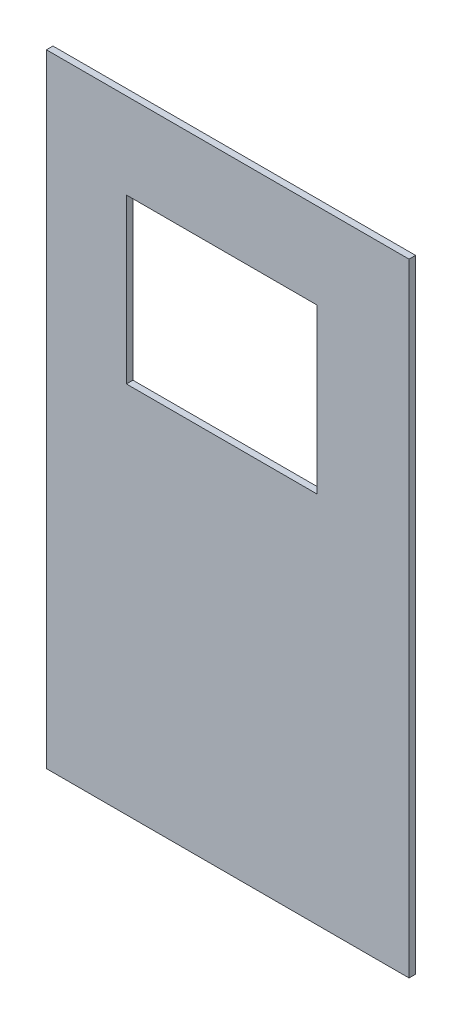
ISO-10303-21;
HEADER;
FILE_DESCRIPTION(('STEP AP214'),'2;1');
FILE_NAME('part.step','',(''),(''),'','','');
FILE_SCHEMA(('AUTOMOTIVE_DESIGN { 1 0 10303 214 1 1 1 1 }'));
ENDSEC;
DATA;
#1=APPLICATION_CONTEXT('core data for automotive mechanical design processes');
#2=APPLICATION_PROTOCOL_DEFINITION('international standard','automotive_design',2000,#1);
#3=PRODUCT_CONTEXT('',#1,'mechanical');
#4=PRODUCT('Part','Part','',(#3));
#5=PRODUCT_RELATED_PRODUCT_CATEGORY('part','',(#4));
#6=PRODUCT_DEFINITION_FORMATION('','',#4);
#7=PRODUCT_DEFINITION_CONTEXT('part definition',#1,'design');
#8=PRODUCT_DEFINITION('design','',#6,#7);
#9=PRODUCT_DEFINITION_SHAPE('','',#8);
#10=(LENGTH_UNIT() NAMED_UNIT(*) SI_UNIT(.MILLI.,.METRE.));
#11=(NAMED_UNIT(*) PLANE_ANGLE_UNIT() SI_UNIT($,.RADIAN.));
#12=(NAMED_UNIT(*) SI_UNIT($,.STERADIAN.) SOLID_ANGLE_UNIT());
#13=UNCERTAINTY_MEASURE_WITH_UNIT(LENGTH_MEASURE(1.E-05),#10,'distance_accuracy_value','');
#14=(GEOMETRIC_REPRESENTATION_CONTEXT(3) GLOBAL_UNCERTAINTY_ASSIGNED_CONTEXT((#13)) GLOBAL_UNIT_ASSIGNED_CONTEXT((#10,
#11,#12)) REPRESENTATION_CONTEXT('',''));
#15=CARTESIAN_POINT('',(0.,0.,0.));
#16=DIRECTION('',(0.,0.,1.));
#17=DIRECTION('',(1.,0.,0.));
#18=AXIS2_PLACEMENT_3D('',#15,#16,#17);
#19=CARTESIAN_POINT('',(-161.832061068702,173.5368956743,4.2));
#20=DIRECTION('',(1.,0.,0.));
#21=DIRECTION('',(0.,0.,-1.));
#22=AXIS2_PLACEMENT_3D('',#19,#20,#21);
#23=PLANE('',#22);
#24=DIRECTION('',(0.,-1.,0.));
#25=VECTOR('',#24,1.);
#26=CARTESIAN_POINT('',(-161.832061068702,173.5368956743,0.));
#27=LINE('',#26,#25);
#28=CARTESIAN_POINT('',(-161.832061068702,173.5368956743,0.));
#29=VERTEX_POINT('',#28);
#30=CARTESIAN_POINT('',(-161.832061068702,-226.4631043257,0.));
#31=VERTEX_POINT('',#30);
#32=EDGE_CURVE('E152',#29,#31,#27,.T.);
#33=ORIENTED_EDGE('',*,*,#32,.T.);
#34=DIRECTION('',(0.,0.,-1.));
#35=VECTOR('',#34,1.);
#36=CARTESIAN_POINT('',(-161.832061068702,-226.4631043257,4.2));
#37=LINE('',#36,#35);
#38=CARTESIAN_POINT('',(-161.832061068702,-226.4631043257,4.2));
#39=VERTEX_POINT('',#38);
#40=EDGE_CURVE('E11',#39,#31,#37,.T.);
#41=ORIENTED_EDGE('',*,*,#40,.F.);
#42=DIRECTION('',(0.,-1.,0.));
#43=VECTOR('',#42,1.);
#44=CARTESIAN_POINT('',(-161.832061068702,173.5368956743,4.2));
#45=LINE('',#44,#43);
#46=CARTESIAN_POINT('',(-161.832061068702,173.5368956743,4.2));
#47=VERTEX_POINT('',#46);
#48=EDGE_CURVE('E153',#47,#39,#45,.T.);
#49=ORIENTED_EDGE('',*,*,#48,.F.);
#50=DIRECTION('',(0.,0.,-1.));
#51=VECTOR('',#50,1.);
#52=CARTESIAN_POINT('',(-161.832061068702,173.5368956743,4.2));
#53=LINE('',#52,#51);
#54=EDGE_CURVE('E167',#47,#29,#53,.T.);
#55=ORIENTED_EDGE('',*,*,#54,.T.);
#56=EDGE_LOOP('',(#33,#41,#49,#55));
#57=FACE_BOUND('',#56,.T.);
#58=ADVANCED_FACE('F39',(#57),#23,.F.);
#59=CARTESIAN_POINT('',(-161.832061068702,-226.4631043257,4.2));
#60=DIRECTION('',(0.,1.,0.));
#61=DIRECTION('',(-1.,0.,0.));
#62=AXIS2_PLACEMENT_3D('',#59,#60,#61);
#63=PLANE('',#62);
#64=DIRECTION('',(1.,0.,0.));
#65=VECTOR('',#64,1.);
#66=CARTESIAN_POINT('',(-161.832061068702,-226.4631043257,0.));
#67=LINE('',#66,#65);
#68=CARTESIAN_POINT('',(71.1679389312977,-226.4631043257,0.));
#69=VERTEX_POINT('',#68);
#70=EDGE_CURVE('E171',#31,#69,#67,.T.);
#71=ORIENTED_EDGE('',*,*,#70,.T.);
#72=DIRECTION('',(0.,0.,-1.));
#73=VECTOR('',#72,1.);
#74=CARTESIAN_POINT('',(71.1679389312977,-226.4631043257,4.2));
#75=LINE('',#74,#73);
#76=CARTESIAN_POINT('',(71.1679389312977,-226.4631043257,4.2));
#77=VERTEX_POINT('',#76);
#78=EDGE_CURVE('E47',#77,#69,#75,.T.);
#79=ORIENTED_EDGE('',*,*,#78,.F.);
#80=DIRECTION('',(1.,0.,0.));
#81=VECTOR('',#80,1.);
#82=CARTESIAN_POINT('',(-161.832061068702,-226.4631043257,4.2));
#83=LINE('',#82,#81);
#84=EDGE_CURVE('E157',#39,#77,#83,.T.);
#85=ORIENTED_EDGE('',*,*,#84,.F.);
#86=ORIENTED_EDGE('',*,*,#40,.T.);
#87=EDGE_LOOP('',(#71,#79,#85,#86));
#88=FACE_BOUND('',#87,.T.);
#89=ADVANCED_FACE('F205',(#88),#63,.F.);
#90=CARTESIAN_POINT('',(71.1679389312977,173.5368956743,4.2));
#91=DIRECTION('',(-1.,0.,0.));
#92=DIRECTION('',(0.,-1.,0.));
#93=AXIS2_PLACEMENT_3D('',#90,#91,#92);
#94=PLANE('',#93);
#95=DIRECTION('',(0.,1.,0.));
#96=VECTOR('',#95,1.);
#97=CARTESIAN_POINT('',(71.1679389312977,173.5368956743,0.));
#98=LINE('',#97,#96);
#99=CARTESIAN_POINT('',(71.1679389312977,173.5368956743,0.));
#100=VERTEX_POINT('',#99);
#101=EDGE_CURVE('E174',#69,#100,#98,.T.);
#102=ORIENTED_EDGE('',*,*,#101,.T.);
#103=DIRECTION('',(0.,0.,-1.));
#104=VECTOR('',#103,1.);
#105=CARTESIAN_POINT('',(71.1679389312977,173.5368956743,4.2));
#106=LINE('',#105,#104);
#107=CARTESIAN_POINT('',(71.1679389312977,173.5368956743,4.2));
#108=VERTEX_POINT('',#107);
#109=EDGE_CURVE('E182',#108,#100,#106,.T.);
#110=ORIENTED_EDGE('',*,*,#109,.F.);
#111=DIRECTION('',(0.,1.,0.));
#112=VECTOR('',#111,1.);
#113=CARTESIAN_POINT('',(71.1679389312977,173.5368956743,4.2));
#114=LINE('',#113,#112);
#115=EDGE_CURVE('E161',#77,#108,#114,.T.);
#116=ORIENTED_EDGE('',*,*,#115,.F.);
#117=ORIENTED_EDGE('',*,*,#78,.T.);
#118=EDGE_LOOP('',(#102,#110,#116,#117));
#119=FACE_BOUND('',#118,.T.);
#120=ADVANCED_FACE('F191',(#119),#94,.F.);
#121=CARTESIAN_POINT('',(-161.832061068702,173.5368956743,4.2));
#122=DIRECTION('',(0.,-1.,0.));
#123=DIRECTION('',(0.,0.,-1.));
#124=AXIS2_PLACEMENT_3D('',#121,#122,#123);
#125=PLANE('',#124);
#126=DIRECTION('',(-1.,0.,0.));
#127=VECTOR('',#126,1.);
#128=CARTESIAN_POINT('',(-161.832061068702,173.5368956743,0.));
#129=LINE('',#128,#127);
#130=EDGE_CURVE('E158',#100,#29,#129,.T.);
#131=ORIENTED_EDGE('',*,*,#130,.T.);
#132=ORIENTED_EDGE('',*,*,#54,.F.);
#133=DIRECTION('',(-1.,0.,0.));
#134=VECTOR('',#133,1.);
#135=CARTESIAN_POINT('',(-161.832061068702,173.5368956743,4.2));
#136=LINE('',#135,#134);
#137=EDGE_CURVE('E164',#108,#47,#136,.T.);
#138=ORIENTED_EDGE('',*,*,#137,.F.);
#139=ORIENTED_EDGE('',*,*,#109,.T.);
#140=EDGE_LOOP('',(#131,#132,#138,#139));
#141=FACE_BOUND('',#140,.T.);
#142=ADVANCED_FACE('F198',(#141),#125,.F.);
#143=CARTESIAN_POINT('',(0.,0.,4.2));
#144=DIRECTION('',(0.,0.,1.));
#145=DIRECTION('',(1.,0.,0.));
#146=AXIS2_PLACEMENT_3D('',#143,#144,#145);
#147=PLANE('',#146);
#148=DIRECTION('',(0.,-1.,0.));
#149=VECTOR('',#148,1.);
#150=CARTESIAN_POINT('',(-110.458034203077,0.,4.2));
#151=LINE('',#150,#149);
#152=CARTESIAN_POINT('',(-110.458034203077,118.439757380997,4.2));
#153=VERTEX_POINT('',#152);
#154=CARTESIAN_POINT('',(-110.458034203077,13.2802259512914,4.2));
#155=VERTEX_POINT('',#154);
#156=EDGE_CURVE('E110',#153,#155,#151,.T.);
#157=ORIENTED_EDGE('',*,*,#156,.F.);
#158=DIRECTION('',(-1.,0.,0.));
#159=VECTOR('',#158,1.);
#160=CARTESIAN_POINT('',(0.,118.439757380997,4.2));
#161=LINE('',#160,#159);
#162=CARTESIAN_POINT('',(11.8656558357202,118.439757380997,4.2));
#163=VERTEX_POINT('',#162);
#164=EDGE_CURVE('E147',#163,#153,#161,.T.);
#165=ORIENTED_EDGE('',*,*,#164,.F.);
#166=DIRECTION('',(0.,1.,0.));
#167=VECTOR('',#166,1.);
#168=CARTESIAN_POINT('',(11.8656558357202,0.,4.2));
#169=LINE('',#168,#167);
#170=CARTESIAN_POINT('',(11.8656558357202,13.2802259512914,4.2));
#171=VERTEX_POINT('',#170);
#172=EDGE_CURVE('E144',#171,#163,#169,.T.);
#173=ORIENTED_EDGE('',*,*,#172,.F.);
#174=DIRECTION('',(1.,0.,0.));
#175=VECTOR('',#174,1.);
#176=CARTESIAN_POINT('',(0.,13.2802259512914,4.2));
#177=LINE('',#176,#175);
#178=EDGE_CURVE('E135',#155,#171,#177,.T.);
#179=ORIENTED_EDGE('',*,*,#178,.F.);
#180=EDGE_LOOP('',(#157,#165,#173,#179));
#181=FACE_BOUND('',#180,.T.);
#182=ORIENTED_EDGE('',*,*,#48,.T.);
#183=ORIENTED_EDGE('',*,*,#84,.T.);
#184=ORIENTED_EDGE('',*,*,#115,.T.);
#185=ORIENTED_EDGE('',*,*,#137,.T.);
#186=EDGE_LOOP('',(#182,#183,#184,#185));
#187=FACE_BOUND('',#186,.T.);
#188=ADVANCED_FACE('F204',(#181,#187),#147,.T.);
#189=CARTESIAN_POINT('',(0.,0.,0.));
#190=DIRECTION('',(0.,0.,1.));
#191=DIRECTION('',(1.,0.,0.));
#192=AXIS2_PLACEMENT_3D('',#189,#190,#191);
#193=PLANE('',#192);
#194=DIRECTION('',(-1.,0.,0.));
#195=VECTOR('',#194,1.);
#196=CARTESIAN_POINT('',(-110.458034203077,118.439757380997,0.));
#197=LINE('',#196,#195);
#198=CARTESIAN_POINT('',(11.8656558357202,118.439757380997,0.));
#199=VERTEX_POINT('',#198);
#200=CARTESIAN_POINT('',(-110.458034203077,118.439757380997,0.));
#201=VERTEX_POINT('',#200);
#202=EDGE_CURVE('E114',#199,#201,#197,.T.);
#203=ORIENTED_EDGE('',*,*,#202,.T.);
#204=DIRECTION('',(0.,-1.,0.));
#205=VECTOR('',#204,1.);
#206=CARTESIAN_POINT('',(-110.458034203077,118.439757380997,0.));
#207=LINE('',#206,#205);
#208=CARTESIAN_POINT('',(-110.458034203077,13.2802259512914,0.));
#209=VERTEX_POINT('',#208);
#210=EDGE_CURVE('E107',#201,#209,#207,.T.);
#211=ORIENTED_EDGE('',*,*,#210,.T.);
#212=DIRECTION('',(1.,0.,0.));
#213=VECTOR('',#212,1.);
#214=CARTESIAN_POINT('',(-110.458034203077,13.2802259512914,0.));
#215=LINE('',#214,#213);
#216=CARTESIAN_POINT('',(11.8656558357202,13.2802259512914,0.));
#217=VERTEX_POINT('',#216);
#218=EDGE_CURVE('E117',#209,#217,#215,.T.);
#219=ORIENTED_EDGE('',*,*,#218,.T.);
#220=DIRECTION('',(0.,1.,0.));
#221=VECTOR('',#220,1.);
#222=CARTESIAN_POINT('',(11.8656558357202,118.439757380997,0.));
#223=LINE('',#222,#221);
#224=EDGE_CURVE('E62',#217,#199,#223,.T.);
#225=ORIENTED_EDGE('',*,*,#224,.T.);
#226=EDGE_LOOP('',(#203,#211,#219,#225));
#227=FACE_BOUND('',#226,.T.);
#228=ORIENTED_EDGE('',*,*,#32,.F.);
#229=ORIENTED_EDGE('',*,*,#130,.F.);
#230=ORIENTED_EDGE('',*,*,#101,.F.);
#231=ORIENTED_EDGE('',*,*,#70,.F.);
#232=EDGE_LOOP('',(#228,#229,#230,#231));
#233=FACE_BOUND('',#232,.T.);
#234=ADVANCED_FACE('F122',(#227,#233),#193,.F.);
#235=CARTESIAN_POINT('',(-110.458034203077,118.439757380997,0.));
#236=DIRECTION('',(-1.,0.,0.));
#237=DIRECTION('',(0.,0.,1.));
#238=AXIS2_PLACEMENT_3D('',#235,#236,#237);
#239=PLANE('',#238);
#240=ORIENTED_EDGE('',*,*,#156,.T.);
#241=DIRECTION('',(0.,0.,1.));
#242=VECTOR('',#241,1.);
#243=CARTESIAN_POINT('',(-110.458034203077,13.2802259512914,0.));
#244=LINE('',#243,#242);
#245=EDGE_CURVE('E54',#209,#155,#244,.T.);
#246=ORIENTED_EDGE('',*,*,#245,.F.);
#247=ORIENTED_EDGE('',*,*,#210,.F.);
#248=DIRECTION('',(0.,0.,1.));
#249=VECTOR('',#248,1.);
#250=CARTESIAN_POINT('',(-110.458034203077,118.439757380997,0.));
#251=LINE('',#250,#249);
#252=EDGE_CURVE('E132',#201,#153,#251,.T.);
#253=ORIENTED_EDGE('',*,*,#252,.T.);
#254=EDGE_LOOP('',(#240,#246,#247,#253));
#255=FACE_BOUND('',#254,.T.);
#256=ADVANCED_FACE('F104',(#255),#239,.F.);
#257=CARTESIAN_POINT('',(-110.458034203077,118.439757380997,0.));
#258=DIRECTION('',(0.,1.,0.));
#259=DIRECTION('',(0.,0.,1.));
#260=AXIS2_PLACEMENT_3D('',#257,#258,#259);
#261=PLANE('',#260);
#262=ORIENTED_EDGE('',*,*,#164,.T.);
#263=ORIENTED_EDGE('',*,*,#252,.F.);
#264=ORIENTED_EDGE('',*,*,#202,.F.);
#265=DIRECTION('',(0.,0.,1.));
#266=VECTOR('',#265,1.);
#267=CARTESIAN_POINT('',(11.8656558357202,118.439757380997,0.));
#268=LINE('',#267,#266);
#269=EDGE_CURVE('E136',#199,#163,#268,.T.);
#270=ORIENTED_EDGE('',*,*,#269,.T.);
#271=EDGE_LOOP('',(#262,#263,#264,#270));
#272=FACE_BOUND('',#271,.T.);
#273=ADVANCED_FACE('F222',(#272),#261,.F.);
#274=CARTESIAN_POINT('',(11.8656558357202,118.439757380997,0.));
#275=DIRECTION('',(1.,0.,0.));
#276=DIRECTION('',(0.,0.,-1.));
#277=AXIS2_PLACEMENT_3D('',#274,#275,#276);
#278=PLANE('',#277);
#279=ORIENTED_EDGE('',*,*,#172,.T.);
#280=ORIENTED_EDGE('',*,*,#269,.F.);
#281=ORIENTED_EDGE('',*,*,#224,.F.);
#282=DIRECTION('',(0.,0.,1.));
#283=VECTOR('',#282,1.);
#284=CARTESIAN_POINT('',(11.8656558357202,13.2802259512914,0.));
#285=LINE('',#284,#283);
#286=EDGE_CURVE('E113',#217,#171,#285,.T.);
#287=ORIENTED_EDGE('',*,*,#286,.T.);
#288=EDGE_LOOP('',(#279,#280,#281,#287));
#289=FACE_BOUND('',#288,.T.);
#290=ADVANCED_FACE('F225',(#289),#278,.F.);
#291=CARTESIAN_POINT('',(-110.458034203077,13.2802259512914,0.));
#292=DIRECTION('',(0.,-1.,0.));
#293=DIRECTION('',(0.,0.,-1.));
#294=AXIS2_PLACEMENT_3D('',#291,#292,#293);
#295=PLANE('',#294);
#296=ORIENTED_EDGE('',*,*,#178,.T.);
#297=ORIENTED_EDGE('',*,*,#286,.F.);
#298=ORIENTED_EDGE('',*,*,#218,.F.);
#299=ORIENTED_EDGE('',*,*,#245,.T.);
#300=EDGE_LOOP('',(#296,#297,#298,#299));
#301=FACE_BOUND('',#300,.T.);
#302=ADVANCED_FACE('F118',(#301),#295,.F.);
#303=CLOSED_SHELL('',(#58,#89,#120,#142,#188,#234,#256,#273,#290,#302));
#304=MANIFOLD_SOLID_BREP('B2',#303);
#305=ADVANCED_BREP_SHAPE_REPRESENTATION('',(#18,#304),#14);
#306=SHAPE_DEFINITION_REPRESENTATION(#9,#305);
ENDSEC;
END-ISO-10303-21;
